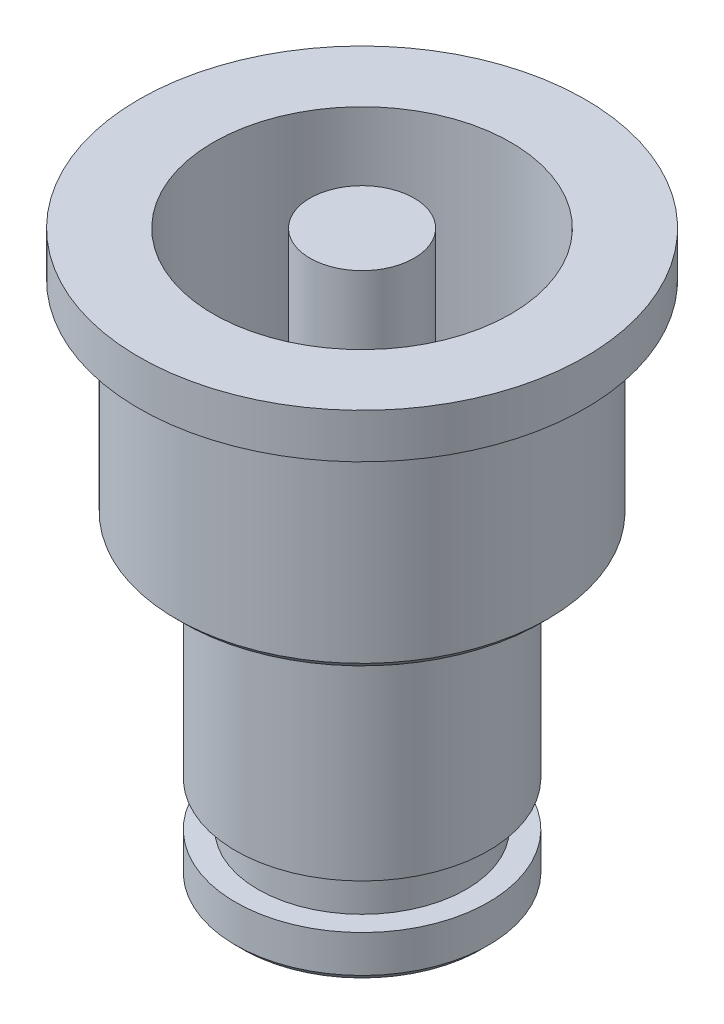
ISO-10303-21;
HEADER;
FILE_DESCRIPTION(('STEP AP214'),'2;1');
FILE_NAME('part.step','',(''),(''),'','','');
FILE_SCHEMA(('AUTOMOTIVE_DESIGN { 1 0 10303 214 1 1 1 1 }'));
ENDSEC;
DATA;
#1=APPLICATION_CONTEXT('core data for automotive mechanical design processes');
#2=APPLICATION_PROTOCOL_DEFINITION('international standard','automotive_design',2000,#1);
#3=PRODUCT_CONTEXT('',#1,'mechanical');
#4=PRODUCT('Part','Part','',(#3));
#5=PRODUCT_RELATED_PRODUCT_CATEGORY('part','',(#4));
#6=PRODUCT_DEFINITION_FORMATION('','',#4);
#7=PRODUCT_DEFINITION_CONTEXT('part definition',#1,'design');
#8=PRODUCT_DEFINITION('design','',#6,#7);
#9=PRODUCT_DEFINITION_SHAPE('','',#8);
#10=(LENGTH_UNIT() NAMED_UNIT(*) SI_UNIT(.MILLI.,.METRE.));
#11=(NAMED_UNIT(*) PLANE_ANGLE_UNIT() SI_UNIT($,.RADIAN.));
#12=(NAMED_UNIT(*) SI_UNIT($,.STERADIAN.) SOLID_ANGLE_UNIT());
#13=UNCERTAINTY_MEASURE_WITH_UNIT(LENGTH_MEASURE(1.E-05),#10,'distance_accuracy_value','');
#14=(GEOMETRIC_REPRESENTATION_CONTEXT(3) GLOBAL_UNCERTAINTY_ASSIGNED_CONTEXT((#13)) GLOBAL_UNIT_ASSIGNED_CONTEXT((#10,
#11,#12)) REPRESENTATION_CONTEXT('',''));
#15=CARTESIAN_POINT('',(0.,0.,0.));
#16=DIRECTION('',(0.,0.,1.));
#17=DIRECTION('',(1.,0.,0.));
#18=AXIS2_PLACEMENT_3D('',#15,#16,#17);
#19=CARTESIAN_POINT('',(0.,-5.,0.));
#20=DIRECTION('',(0.,-1.,0.));
#21=DIRECTION('',(1.,0.,0.));
#22=AXIS2_PLACEMENT_3D('',#19,#20,#21);
#23=PLANE('',#22);
#24=CARTESIAN_POINT('',(0.,-5.,0.));
#25=DIRECTION('',(0.,-1.,0.));
#26=DIRECTION('',(1.,0.,0.));
#27=AXIS2_PLACEMENT_3D('',#24,#25,#26);
#28=CIRCLE('',#27,10.);
#29=CARTESIAN_POINT('',(10.,-5.,0.));
#30=VERTEX_POINT('',#29);
#31=EDGE_CURVE('E159',#30,#30,#28,.F.);
#32=ORIENTED_EDGE('',*,*,#31,.F.);
#33=EDGE_LOOP('',(#32));
#34=FACE_BOUND('',#33,.T.);
#35=CARTESIAN_POINT('',(0.,-5.,0.));
#36=DIRECTION('',(0.,1.,0.));
#37=DIRECTION('',(-1.,0.,0.));
#38=AXIS2_PLACEMENT_3D('',#35,#36,#37);
#39=CIRCLE('',#38,15.);
#40=CARTESIAN_POINT('',(-15.,-5.,0.));
#41=VERTEX_POINT('',#40);
#42=EDGE_CURVE('E149',#41,#41,#39,.T.);
#43=ORIENTED_EDGE('',*,*,#42,.T.);
#44=EDGE_LOOP('',(#43));
#45=FACE_BOUND('',#44,.T.);
#46=ADVANCED_FACE('F46',(#34,#45),#23,.F.);
#47=CARTESIAN_POINT('',(0.,-5.,0.));
#48=DIRECTION('',(0.,1.,0.));
#49=DIRECTION('',(-1.,0.,0.));
#50=AXIS2_PLACEMENT_3D('',#47,#48,#49);
#51=CYLINDRICAL_SURFACE('',#50,15.);
#52=ORIENTED_EDGE('',*,*,#42,.F.);
#53=EDGE_LOOP('',(#52));
#54=FACE_BOUND('',#53,.T.);
#55=CARTESIAN_POINT('',(0.,-8.,0.));
#56=DIRECTION('',(0.,1.,0.));
#57=DIRECTION('',(-1.,0.,0.));
#58=AXIS2_PLACEMENT_3D('',#55,#56,#57);
#59=CIRCLE('',#58,15.);
#60=CARTESIAN_POINT('',(-15.,-8.,0.));
#61=VERTEX_POINT('',#60);
#62=EDGE_CURVE('E146',#61,#61,#59,.T.);
#63=ORIENTED_EDGE('',*,*,#62,.T.);
#64=EDGE_LOOP('',(#63));
#65=FACE_BOUND('',#64,.T.);
#66=ADVANCED_FACE('F190',(#54,#65),#51,.T.);
#67=CARTESIAN_POINT('',(15.,-8.,0.));
#68=DIRECTION('',(0.,1.,0.));
#69=DIRECTION('',(-1.,0.,0.));
#70=AXIS2_PLACEMENT_3D('',#67,#68,#69);
#71=PLANE('',#70);
#72=ORIENTED_EDGE('',*,*,#62,.F.);
#73=EDGE_LOOP('',(#72));
#74=FACE_BOUND('',#73,.T.);
#75=CARTESIAN_POINT('',(0.,-8.,0.));
#76=DIRECTION('',(0.,1.,0.));
#77=DIRECTION('',(-1.,0.,0.));
#78=AXIS2_PLACEMENT_3D('',#75,#76,#77);
#79=CIRCLE('',#78,12.5);
#80=CARTESIAN_POINT('',(-12.5,-8.,0.));
#81=VERTEX_POINT('',#80);
#82=EDGE_CURVE('E143',#81,#81,#79,.T.);
#83=ORIENTED_EDGE('',*,*,#82,.T.);
#84=EDGE_LOOP('',(#83));
#85=FACE_BOUND('',#84,.T.);
#86=ADVANCED_FACE('F197',(#74,#85),#71,.F.);
#87=CARTESIAN_POINT('',(0.,-5.,0.));
#88=DIRECTION('',(0.,1.,0.));
#89=DIRECTION('',(-1.,0.,0.));
#90=AXIS2_PLACEMENT_3D('',#87,#88,#89);
#91=CYLINDRICAL_SURFACE('',#90,12.5);
#92=CARTESIAN_POINT('',(0.,-21.5,0.));
#93=DIRECTION('',(0.,1.,0.));
#94=DIRECTION('',(-1.,0.,0.));
#95=AXIS2_PLACEMENT_3D('',#92,#93,#94);
#96=CIRCLE('',#95,12.5);
#97=CARTESIAN_POINT('',(-12.5,-21.5,0.));
#98=VERTEX_POINT('',#97);
#99=EDGE_CURVE('E56',#98,#98,#96,.T.);
#100=ORIENTED_EDGE('',*,*,#99,.T.);
#101=EDGE_LOOP('',(#100));
#102=FACE_BOUND('',#101,.T.);
#103=ORIENTED_EDGE('',*,*,#82,.F.);
#104=EDGE_LOOP('',(#103));
#105=FACE_BOUND('',#104,.T.);
#106=ADVANCED_FACE('F250',(#102,#105),#91,.T.);
#107=CARTESIAN_POINT('',(12.5,-22.,0.));
#108=DIRECTION('',(0.,1.,0.));
#109=DIRECTION('',(-1.,0.,0.));
#110=AXIS2_PLACEMENT_3D('',#107,#108,#109);
#111=PLANE('',#110);
#112=CARTESIAN_POINT('',(0.,-22.,0.));
#113=DIRECTION('',(0.,1.,0.));
#114=DIRECTION('',(-1.,0.,0.));
#115=AXIS2_PLACEMENT_3D('',#112,#113,#114);
#116=CIRCLE('',#115,12.);
#117=CARTESIAN_POINT('',(-12.,-22.,0.));
#118=VERTEX_POINT('',#117);
#119=EDGE_CURVE('E11',#118,#118,#116,.F.);
#120=ORIENTED_EDGE('',*,*,#119,.T.);
#121=EDGE_LOOP('',(#120));
#122=FACE_BOUND('',#121,.T.);
#123=CARTESIAN_POINT('',(0.,-22.,0.));
#124=DIRECTION('',(0.,1.,0.));
#125=DIRECTION('',(-1.,0.,0.));
#126=AXIS2_PLACEMENT_3D('',#123,#124,#125);
#127=CIRCLE('',#126,8.5);
#128=CARTESIAN_POINT('',(-8.5,-22.,0.));
#129=VERTEX_POINT('',#128);
#130=EDGE_CURVE('E140',#129,#129,#127,.T.);
#131=ORIENTED_EDGE('',*,*,#130,.T.);
#132=EDGE_LOOP('',(#131));
#133=FACE_BOUND('',#132,.T.);
#134=ADVANCED_FACE('F246',(#122,#133),#111,.F.);
#135=CARTESIAN_POINT('',(0.,-5.,0.));
#136=DIRECTION('',(0.,1.,0.));
#137=DIRECTION('',(-1.,0.,0.));
#138=AXIS2_PLACEMENT_3D('',#135,#136,#137);
#139=CYLINDRICAL_SURFACE('',#138,8.5);
#140=ORIENTED_EDGE('',*,*,#130,.F.);
#141=EDGE_LOOP('',(#140));
#142=FACE_BOUND('',#141,.T.);
#143=CARTESIAN_POINT('',(0.,-37.,0.));
#144=DIRECTION('',(0.,1.,0.));
#145=DIRECTION('',(-1.,0.,0.));
#146=AXIS2_PLACEMENT_3D('',#143,#144,#145);
#147=CIRCLE('',#146,8.5);
#148=CARTESIAN_POINT('',(-8.5,-37.,0.));
#149=VERTEX_POINT('',#148);
#150=EDGE_CURVE('E137',#149,#149,#147,.T.);
#151=ORIENTED_EDGE('',*,*,#150,.T.);
#152=EDGE_LOOP('',(#151));
#153=FACE_BOUND('',#152,.T.);
#154=ADVANCED_FACE('F242',(#142,#153),#139,.T.);
#155=CARTESIAN_POINT('',(8.5,-37.,0.));
#156=DIRECTION('',(0.,1.,0.));
#157=DIRECTION('',(-1.,0.,0.));
#158=AXIS2_PLACEMENT_3D('',#155,#156,#157);
#159=PLANE('',#158);
#160=ORIENTED_EDGE('',*,*,#150,.F.);
#161=EDGE_LOOP('',(#160));
#162=FACE_BOUND('',#161,.T.);
#163=CARTESIAN_POINT('',(0.,-37.,0.));
#164=DIRECTION('',(0.,1.,0.));
#165=DIRECTION('',(-1.,0.,0.));
#166=AXIS2_PLACEMENT_3D('',#163,#164,#165);
#167=CIRCLE('',#166,7.);
#168=CARTESIAN_POINT('',(-7.,-37.,0.));
#169=VERTEX_POINT('',#168);
#170=EDGE_CURVE('E134',#169,#169,#167,.T.);
#171=ORIENTED_EDGE('',*,*,#170,.T.);
#172=EDGE_LOOP('',(#171));
#173=FACE_BOUND('',#172,.T.);
#174=ADVANCED_FACE('F235',(#162,#173),#159,.F.);
#175=CARTESIAN_POINT('',(0.,-5.,0.));
#176=DIRECTION('',(0.,1.,0.));
#177=DIRECTION('',(-1.,0.,0.));
#178=AXIS2_PLACEMENT_3D('',#175,#176,#177);
#179=CYLINDRICAL_SURFACE('',#178,7.);
#180=ORIENTED_EDGE('',*,*,#170,.F.);
#181=EDGE_LOOP('',(#180));
#182=FACE_BOUND('',#181,.T.);
#183=CARTESIAN_POINT('',(0.,-40.,0.));
#184=DIRECTION('',(0.,1.,0.));
#185=DIRECTION('',(-1.,0.,0.));
#186=AXIS2_PLACEMENT_3D('',#183,#184,#185);
#187=CIRCLE('',#186,7.);
#188=CARTESIAN_POINT('',(-7.,-40.,0.));
#189=VERTEX_POINT('',#188);
#190=EDGE_CURVE('E131',#189,#189,#187,.T.);
#191=ORIENTED_EDGE('',*,*,#190,.T.);
#192=EDGE_LOOP('',(#191));
#193=FACE_BOUND('',#192,.T.);
#194=ADVANCED_FACE('F229',(#182,#193),#179,.T.);
#195=CARTESIAN_POINT('',(7.,-40.,0.));
#196=DIRECTION('',(0.,-1.,0.));
#197=DIRECTION('',(1.,0.,0.));
#198=AXIS2_PLACEMENT_3D('',#195,#196,#197);
#199=PLANE('',#198);
#200=ORIENTED_EDGE('',*,*,#190,.F.);
#201=EDGE_LOOP('',(#200));
#202=FACE_BOUND('',#201,.T.);
#203=CARTESIAN_POINT('',(0.,-40.,0.));
#204=DIRECTION('',(0.,1.,0.));
#205=DIRECTION('',(-1.,0.,0.));
#206=AXIS2_PLACEMENT_3D('',#203,#204,#205);
#207=CIRCLE('',#206,8.5);
#208=CARTESIAN_POINT('',(-8.5,-40.,0.));
#209=VERTEX_POINT('',#208);
#210=EDGE_CURVE('E126',#209,#209,#207,.T.);
#211=ORIENTED_EDGE('',*,*,#210,.T.);
#212=EDGE_LOOP('',(#211));
#213=FACE_BOUND('',#212,.T.);
#214=ADVANCED_FACE('F224',(#202,#213),#199,.F.);
#215=CARTESIAN_POINT('',(0.,-5.,0.));
#216=DIRECTION('',(0.,1.,0.));
#217=DIRECTION('',(-1.,0.,0.));
#218=AXIS2_PLACEMENT_3D('',#215,#216,#217);
#219=CYLINDRICAL_SURFACE('',#218,8.5);
#220=CARTESIAN_POINT('',(0.,-42.5,0.));
#221=DIRECTION('',(0.,1.,0.));
#222=DIRECTION('',(-1.,0.,0.));
#223=AXIS2_PLACEMENT_3D('',#220,#221,#222);
#224=CIRCLE('',#223,8.5);
#225=CARTESIAN_POINT('',(-8.5,-42.5,0.));
#226=VERTEX_POINT('',#225);
#227=EDGE_CURVE('E152',#226,#226,#224,.T.);
#228=ORIENTED_EDGE('',*,*,#227,.T.);
#229=EDGE_LOOP('',(#228));
#230=FACE_BOUND('',#229,.T.);
#231=ORIENTED_EDGE('',*,*,#210,.F.);
#232=EDGE_LOOP('',(#231));
#233=FACE_BOUND('',#232,.T.);
#234=ADVANCED_FACE('F215',(#230,#233),#219,.T.);
#235=CARTESIAN_POINT('',(8.50000000000001,-43.,0.));
#236=DIRECTION('',(0.,1.,0.));
#237=DIRECTION('',(-1.,0.,0.));
#238=AXIS2_PLACEMENT_3D('',#235,#236,#237);
#239=PLANE('',#238);
#240=DIRECTION('',(0.,0.,-1.));
#241=VECTOR('',#240,1.);
#242=CARTESIAN_POINT('',(-1.45,-43.,2.56904651573303));
#243=LINE('',#242,#241);
#244=CARTESIAN_POINT('',(-1.45,-43.,2.56904651573303));
#245=VERTEX_POINT('',#244);
#246=CARTESIAN_POINT('',(-1.44999999999999,-43.,-2.56904651573303));
#247=VERTEX_POINT('',#246);
#248=EDGE_CURVE('E99',#245,#247,#243,.T.);
#249=ORIENTED_EDGE('',*,*,#248,.F.);
#250=CARTESIAN_POINT('',(0.,-43.,0.));
#251=DIRECTION('',(0.,-1.,0.));
#252=DIRECTION('',(1.,0.,0.));
#253=AXIS2_PLACEMENT_3D('',#250,#251,#252);
#254=CIRCLE('',#253,2.95);
#255=CARTESIAN_POINT('',(1.45,-43.,2.56904651573303));
#256=VERTEX_POINT('',#255);
#257=EDGE_CURVE('E64',#256,#245,#254,.T.);
#258=ORIENTED_EDGE('',*,*,#257,.F.);
#259=DIRECTION('',(0.,0.,1.));
#260=VECTOR('',#259,1.);
#261=CARTESIAN_POINT('',(1.45,-43.,2.56904651573303));
#262=LINE('',#261,#260);
#263=CARTESIAN_POINT('',(1.45,-43.,-2.56904651573303));
#264=VERTEX_POINT('',#263);
#265=EDGE_CURVE('E115',#264,#256,#262,.T.);
#266=ORIENTED_EDGE('',*,*,#265,.F.);
#267=CARTESIAN_POINT('',(0.,-43.,0.));
#268=DIRECTION('',(0.,-1.,0.));
#269=DIRECTION('',(1.,0.,0.));
#270=AXIS2_PLACEMENT_3D('',#267,#268,#269);
#271=CIRCLE('',#270,2.95);
#272=EDGE_CURVE('E122',#247,#264,#271,.T.);
#273=ORIENTED_EDGE('',*,*,#272,.F.);
#274=EDGE_LOOP('',(#249,#258,#266,#273));
#275=FACE_BOUND('',#274,.T.);
#276=CARTESIAN_POINT('',(0.,-43.,0.));
#277=DIRECTION('',(0.,1.,0.));
#278=DIRECTION('',(-1.,0.,0.));
#279=AXIS2_PLACEMENT_3D('',#276,#277,#278);
#280=CIRCLE('',#279,7.99999999999999);
#281=CARTESIAN_POINT('',(-7.99999999999999,-43.,0.));
#282=VERTEX_POINT('',#281);
#283=EDGE_CURVE('E155',#282,#282,#280,.F.);
#284=ORIENTED_EDGE('',*,*,#283,.T.);
#285=EDGE_LOOP('',(#284));
#286=FACE_BOUND('',#285,.T.);
#287=ADVANCED_FACE('F207',(#275,#286),#239,.F.);
#288=CARTESIAN_POINT('',(0.,-42.5,0.));
#289=DIRECTION('',(0.,1.,0.));
#290=DIRECTION('',(-1.,0.,0.));
#291=AXIS2_PLACEMENT_3D('',#288,#289,#290);
#292=CONICAL_SURFACE('',#291,8.5,0.785398163397431);
#293=ORIENTED_EDGE('',*,*,#283,.F.);
#294=EDGE_LOOP('',(#293));
#295=FACE_BOUND('',#294,.T.);
#296=ORIENTED_EDGE('',*,*,#227,.F.);
#297=EDGE_LOOP('',(#296));
#298=FACE_BOUND('',#297,.T.);
#299=ADVANCED_FACE('F203',(#295,#298),#292,.T.);
#300=CARTESIAN_POINT('',(0.,-21.5,0.));
#301=DIRECTION('',(0.,1.,0.));
#302=DIRECTION('',(-1.,0.,0.));
#303=AXIS2_PLACEMENT_3D('',#300,#301,#302);
#304=CONICAL_SURFACE('',#303,12.5,0.785398163397454);
#305=ORIENTED_EDGE('',*,*,#119,.F.);
#306=EDGE_LOOP('',(#305));
#307=FACE_BOUND('',#306,.T.);
#308=ORIENTED_EDGE('',*,*,#99,.F.);
#309=EDGE_LOOP('',(#308));
#310=FACE_BOUND('',#309,.T.);
#311=ADVANCED_FACE('F49',(#307,#310),#304,.T.);
#312=CARTESIAN_POINT('',(0.,-35.,0.));
#313=DIRECTION('',(0.,-1.,0.));
#314=DIRECTION('',(1.,0.,0.));
#315=AXIS2_PLACEMENT_3D('',#312,#313,#314);
#316=CYLINDRICAL_SURFACE('',#315,2.95);
#317=ORIENTED_EDGE('',*,*,#257,.T.);
#318=DIRECTION('',(0.,-1.,0.));
#319=VECTOR('',#318,1.);
#320=CARTESIAN_POINT('',(-1.45,-35.,2.56904651573303));
#321=LINE('',#320,#319);
#322=CARTESIAN_POINT('',(-1.45,-35.,2.56904651573303));
#323=VERTEX_POINT('',#322);
#324=EDGE_CURVE('E87',#323,#245,#321,.T.);
#325=ORIENTED_EDGE('',*,*,#324,.F.);
#326=CARTESIAN_POINT('',(0.,-35.,0.));
#327=DIRECTION('',(0.,-1.,0.));
#328=DIRECTION('',(1.,0.,0.));
#329=AXIS2_PLACEMENT_3D('',#326,#327,#328);
#330=CIRCLE('',#329,2.95);
#331=CARTESIAN_POINT('',(1.45,-35.,2.56904651573303));
#332=VERTEX_POINT('',#331);
#333=EDGE_CURVE('E113',#332,#323,#330,.T.);
#334=ORIENTED_EDGE('',*,*,#333,.F.);
#335=DIRECTION('',(0.,-1.,0.));
#336=VECTOR('',#335,1.);
#337=CARTESIAN_POINT('',(1.45,-35.,2.56904651573303));
#338=LINE('',#337,#336);
#339=EDGE_CURVE('E72',#332,#256,#338,.T.);
#340=ORIENTED_EDGE('',*,*,#339,.T.);
#341=EDGE_LOOP('',(#317,#325,#334,#340));
#342=FACE_BOUND('',#341,.T.);
#343=ADVANCED_FACE('F213',(#342),#316,.F.);
#344=CARTESIAN_POINT('',(1.45,-35.,2.56904651573303));
#345=DIRECTION('',(1.,0.,0.));
#346=DIRECTION('',(0.,0.,-1.));
#347=AXIS2_PLACEMENT_3D('',#344,#345,#346);
#348=PLANE('',#347);
#349=ORIENTED_EDGE('',*,*,#265,.T.);
#350=ORIENTED_EDGE('',*,*,#339,.F.);
#351=DIRECTION('',(0.,0.,1.));
#352=VECTOR('',#351,1.);
#353=CARTESIAN_POINT('',(1.45,-35.,2.56904651573303));
#354=LINE('',#353,#352);
#355=CARTESIAN_POINT('',(1.45,-35.,-2.56904651573303));
#356=VERTEX_POINT('',#355);
#357=EDGE_CURVE('E110',#356,#332,#354,.T.);
#358=ORIENTED_EDGE('',*,*,#357,.F.);
#359=DIRECTION('',(0.,-1.,0.));
#360=VECTOR('',#359,1.);
#361=CARTESIAN_POINT('',(1.45,-35.,-2.56904651573303));
#362=LINE('',#361,#360);
#363=EDGE_CURVE('E103',#356,#264,#362,.T.);
#364=ORIENTED_EDGE('',*,*,#363,.T.);
#365=EDGE_LOOP('',(#349,#350,#358,#364));
#366=FACE_BOUND('',#365,.T.);
#367=ADVANCED_FACE('F321',(#366),#348,.F.);
#368=CARTESIAN_POINT('',(0.,-35.,0.));
#369=DIRECTION('',(0.,-1.,0.));
#370=DIRECTION('',(1.,0.,0.));
#371=AXIS2_PLACEMENT_3D('',#368,#369,#370);
#372=CYLINDRICAL_SURFACE('',#371,2.95);
#373=ORIENTED_EDGE('',*,*,#272,.T.);
#374=ORIENTED_EDGE('',*,*,#363,.F.);
#375=CARTESIAN_POINT('',(0.,-35.,0.));
#376=DIRECTION('',(0.,-1.,0.));
#377=DIRECTION('',(1.,0.,0.));
#378=AXIS2_PLACEMENT_3D('',#375,#376,#377);
#379=CIRCLE('',#378,2.95);
#380=CARTESIAN_POINT('',(-1.45,-35.,-2.56904651573303));
#381=VERTEX_POINT('',#380);
#382=EDGE_CURVE('E106',#381,#356,#379,.T.);
#383=ORIENTED_EDGE('',*,*,#382,.F.);
#384=DIRECTION('',(0.,-1.,0.));
#385=VECTOR('',#384,1.);
#386=CARTESIAN_POINT('',(-1.45,-35.,-2.56904651573303));
#387=LINE('',#386,#385);
#388=EDGE_CURVE('E92',#381,#247,#387,.T.);
#389=ORIENTED_EDGE('',*,*,#388,.T.);
#390=EDGE_LOOP('',(#373,#374,#383,#389));
#391=FACE_BOUND('',#390,.T.);
#392=ADVANCED_FACE('F107',(#391),#372,.F.);
#393=CARTESIAN_POINT('',(-1.45,-35.,2.56904651573303));
#394=DIRECTION('',(-1.,0.,0.));
#395=DIRECTION('',(0.,0.,1.));
#396=AXIS2_PLACEMENT_3D('',#393,#394,#395);
#397=PLANE('',#396);
#398=ORIENTED_EDGE('',*,*,#248,.T.);
#399=ORIENTED_EDGE('',*,*,#388,.F.);
#400=DIRECTION('',(0.,0.,-1.));
#401=VECTOR('',#400,1.);
#402=CARTESIAN_POINT('',(-1.45,-35.,2.56904651573303));
#403=LINE('',#402,#401);
#404=EDGE_CURVE('E96',#323,#381,#403,.T.);
#405=ORIENTED_EDGE('',*,*,#404,.F.);
#406=ORIENTED_EDGE('',*,*,#324,.T.);
#407=EDGE_LOOP('',(#398,#399,#405,#406));
#408=FACE_BOUND('',#407,.T.);
#409=ADVANCED_FACE('F94',(#408),#397,.F.);
#410=CARTESIAN_POINT('',(0.,-35.,0.));
#411=DIRECTION('',(0.,-1.,0.));
#412=DIRECTION('',(1.,0.,0.));
#413=AXIS2_PLACEMENT_3D('',#410,#411,#412);
#414=PLANE('',#413);
#415=ORIENTED_EDGE('',*,*,#333,.T.);
#416=ORIENTED_EDGE('',*,*,#404,.T.);
#417=ORIENTED_EDGE('',*,*,#382,.T.);
#418=ORIENTED_EDGE('',*,*,#357,.T.);
#419=EDGE_LOOP('',(#415,#416,#417,#418));
#420=FACE_BOUND('',#419,.T.);
#421=ADVANCED_FACE('F112',(#420),#414,.T.);
#422=CARTESIAN_POINT('',(0.,-4.999988,0.));
#423=DIRECTION('',(0.,-1.,0.));
#424=DIRECTION('',(1.,0.,0.));
#425=AXIS2_PLACEMENT_3D('',#422,#423,#424);
#426=CYLINDRICAL_SURFACE('',#425,3.5);
#427=CARTESIAN_POINT('',(0.,-20.,0.));
#428=DIRECTION('',(0.,1.,0.));
#429=DIRECTION('',(-1.,0.,0.));
#430=AXIS2_PLACEMENT_3D('',#427,#428,#429);
#431=CIRCLE('',#430,3.5);
#432=CARTESIAN_POINT('',(3.5,-20.,0.));
#433=VERTEX_POINT('',#432);
#434=EDGE_CURVE('E166',#433,#433,#431,.T.);
#435=CARTESIAN_POINT('',(0.,-5.,0.));
#436=DIRECTION('',(0.,-1.,0.));
#437=DIRECTION('',(1.,0.,0.));
#438=AXIS2_PLACEMENT_3D('',#435,#436,#437);
#439=CIRCLE('',#438,3.5);
#440=CARTESIAN_POINT('',(3.5,-5.,0.));
#441=VERTEX_POINT('',#440);
#442=EDGE_CURVE('E51',#441,#441,#439,.F.);
#443=CARTESIAN_POINT('',(3.5,-20.,0.));
#444=CARTESIAN_POINT('',(3.5,-19.84375,0.));
#445=CARTESIAN_POINT('',(3.5,-19.6875,0.));
#446=CARTESIAN_POINT('',(3.5,-19.375,0.));
#447=CARTESIAN_POINT('',(3.5,-19.21875,0.));
#448=CARTESIAN_POINT('',(3.5,-18.90625,0.));
#449=CARTESIAN_POINT('',(3.5,-18.75,0.));
#450=CARTESIAN_POINT('',(3.5,-18.4375,0.));
#451=CARTESIAN_POINT('',(3.5,-18.28125,0.));
#452=CARTESIAN_POINT('',(3.5,-17.96875,0.));
#453=CARTESIAN_POINT('',(3.5,-17.8125,0.));
#454=CARTESIAN_POINT('',(3.5,-17.5,0.));
#455=CARTESIAN_POINT('',(3.5,-17.34375,0.));
#456=CARTESIAN_POINT('',(3.5,-17.03125,0.));
#457=CARTESIAN_POINT('',(3.5,-16.875,0.));
#458=CARTESIAN_POINT('',(3.5,-16.5625,0.));
#459=CARTESIAN_POINT('',(3.5,-16.40625,0.));
#460=CARTESIAN_POINT('',(3.5,-16.09375,0.));
#461=CARTESIAN_POINT('',(3.5,-15.9375,0.));
#462=CARTESIAN_POINT('',(3.5,-15.625,0.));
#463=CARTESIAN_POINT('',(3.5,-15.46875,0.));
#464=CARTESIAN_POINT('',(3.5,-15.15625,0.));
#465=CARTESIAN_POINT('',(3.5,-15.,0.));
#466=CARTESIAN_POINT('',(3.5,-14.6875,0.));
#467=CARTESIAN_POINT('',(3.5,-14.53125,0.));
#468=CARTESIAN_POINT('',(3.5,-14.21875,0.));
#469=CARTESIAN_POINT('',(3.5,-14.0625,0.));
#470=CARTESIAN_POINT('',(3.5,-13.75,0.));
#471=CARTESIAN_POINT('',(3.5,-13.59375,0.));
#472=CARTESIAN_POINT('',(3.5,-13.28125,0.));
#473=CARTESIAN_POINT('',(3.5,-13.125,0.));
#474=CARTESIAN_POINT('',(3.5,-12.8125,0.));
#475=CARTESIAN_POINT('',(3.5,-12.65625,0.));
#476=CARTESIAN_POINT('',(3.5,-12.34375,0.));
#477=CARTESIAN_POINT('',(3.5,-12.1875,0.));
#478=CARTESIAN_POINT('',(3.5,-11.875,0.));
#479=CARTESIAN_POINT('',(3.5,-11.71875,0.));
#480=CARTESIAN_POINT('',(3.5,-11.40625,0.));
#481=CARTESIAN_POINT('',(3.5,-11.25,0.));
#482=CARTESIAN_POINT('',(3.5,-10.9375,0.));
#483=CARTESIAN_POINT('',(3.5,-10.78125,0.));
#484=CARTESIAN_POINT('',(3.5,-10.46875,0.));
#485=CARTESIAN_POINT('',(3.5,-10.3125,0.));
#486=CARTESIAN_POINT('',(3.5,-10.,0.));
#487=CARTESIAN_POINT('',(3.5,-9.84375,0.));
#488=CARTESIAN_POINT('',(3.5,-9.53125,0.));
#489=CARTESIAN_POINT('',(3.5,-9.375,0.));
#490=CARTESIAN_POINT('',(3.5,-9.0625,0.));
#491=CARTESIAN_POINT('',(3.5,-8.90625,0.));
#492=CARTESIAN_POINT('',(3.5,-8.59375,0.));
#493=CARTESIAN_POINT('',(3.5,-8.4375,0.));
#494=CARTESIAN_POINT('',(3.5,-8.125,0.));
#495=CARTESIAN_POINT('',(3.5,-7.96875,0.));
#496=CARTESIAN_POINT('',(3.5,-7.65625,0.));
#497=CARTESIAN_POINT('',(3.5,-7.5,0.));
#498=CARTESIAN_POINT('',(3.5,-7.1875,0.));
#499=CARTESIAN_POINT('',(3.5,-7.03125,0.));
#500=CARTESIAN_POINT('',(3.5,-6.71875,0.));
#501=CARTESIAN_POINT('',(3.5,-6.5625,0.));
#502=CARTESIAN_POINT('',(3.5,-6.25,0.));
#503=CARTESIAN_POINT('',(3.5,-6.09375,0.));
#504=CARTESIAN_POINT('',(3.5,-5.78125,0.));
#505=CARTESIAN_POINT('',(3.5,-5.625,0.));
#506=CARTESIAN_POINT('',(3.5,-5.3125,0.));
#507=CARTESIAN_POINT('',(3.5,-5.15625,0.));
#508=CARTESIAN_POINT('',(3.5,-5.,0.));
#509=B_SPLINE_CURVE_WITH_KNOTS('',3,(#443,#444,#445,#446,#447,#448,#449,#450,#451,#452,#453,
#454,#455,#456,#457,#458,#459,#460,#461,#462,#463,#464,#465,#466,#467,#468,#469,#470,#471,#472,
#473,#474,#475,#476,#477,#478,#479,#480,#481,#482,#483,#484,#485,#486,#487,#488,#489,#490,#491,
#492,#493,#494,#495,#496,#497,#498,#499,#500,#501,#502,#503,#504,#505,#506,#507,#508),
.UNSPECIFIED.,.F.,.F.,(4,2,2,2,2,2,2,2,2,2,2,2,2,2,2,2,2,2,2,2,2,2,2,2,2,2,2,2,2,2,2,2,4),(0.,
0.46875,0.937499999999997,1.40625,1.875,2.34375,2.8125,3.28125,3.75,4.21875,4.6875,5.15625,
5.625,6.09375,6.5625,7.03125,7.5,7.96875,8.4375,8.90625,9.375,9.84375,10.3125,10.78125,11.25,
11.71875,12.1875,12.65625,13.125,13.59375,14.0625,14.53125,15.),.UNSPECIFIED.);
#510=EDGE_CURVE('BSEAM173',#433,#441,#509,.T.);
#511=ORIENTED_EDGE('',*,*,#434,.T.);
#512=ORIENTED_EDGE('',*,*,#442,.F.);
#513=ORIENTED_EDGE('',*,*,#510,.T.);
#514=ORIENTED_EDGE('',*,*,#510,.F.);
#515=EDGE_LOOP('',(#511,#513,#512,#514));
#516=FACE_BOUND('',#515,.T.);
#517=ADVANCED_FACE('F173',(#516),#426,.T.);
#518=CARTESIAN_POINT('',(0.,-4.999988,0.));
#519=DIRECTION('',(0.,-1.,0.));
#520=DIRECTION('',(1.,0.,0.));
#521=AXIS2_PLACEMENT_3D('',#518,#519,#520);
#522=CYLINDRICAL_SURFACE('',#521,10.);
#523=CARTESIAN_POINT('',(0.,-20.,0.));
#524=DIRECTION('',(0.,1.,0.));
#525=DIRECTION('',(-1.,0.,0.));
#526=AXIS2_PLACEMENT_3D('',#523,#524,#525);
#527=CIRCLE('',#526,10.);
#528=CARTESIAN_POINT('',(10.,-20.,0.));
#529=VERTEX_POINT('',#528);
#530=EDGE_CURVE('E161',#529,#529,#527,.T.);
#531=CARTESIAN_POINT('',(10.,-20.,0.));
#532=CARTESIAN_POINT('',(10.,-19.84375,0.));
#533=CARTESIAN_POINT('',(10.,-19.6875,0.));
#534=CARTESIAN_POINT('',(10.,-19.375,0.));
#535=CARTESIAN_POINT('',(10.,-19.21875,0.));
#536=CARTESIAN_POINT('',(10.,-18.90625,0.));
#537=CARTESIAN_POINT('',(10.,-18.75,0.));
#538=CARTESIAN_POINT('',(10.,-18.4375,0.));
#539=CARTESIAN_POINT('',(10.,-18.28125,0.));
#540=CARTESIAN_POINT('',(10.,-17.96875,0.));
#541=CARTESIAN_POINT('',(10.,-17.8125,0.));
#542=CARTESIAN_POINT('',(10.,-17.5,0.));
#543=CARTESIAN_POINT('',(10.,-17.34375,0.));
#544=CARTESIAN_POINT('',(10.,-17.03125,0.));
#545=CARTESIAN_POINT('',(10.,-16.875,0.));
#546=CARTESIAN_POINT('',(10.,-16.5625,0.));
#547=CARTESIAN_POINT('',(10.,-16.40625,0.));
#548=CARTESIAN_POINT('',(10.,-16.09375,0.));
#549=CARTESIAN_POINT('',(10.,-15.9375,0.));
#550=CARTESIAN_POINT('',(10.,-15.625,0.));
#551=CARTESIAN_POINT('',(10.,-15.46875,0.));
#552=CARTESIAN_POINT('',(10.,-15.15625,0.));
#553=CARTESIAN_POINT('',(10.,-15.,0.));
#554=CARTESIAN_POINT('',(10.,-14.6875,0.));
#555=CARTESIAN_POINT('',(10.,-14.53125,0.));
#556=CARTESIAN_POINT('',(10.,-14.21875,0.));
#557=CARTESIAN_POINT('',(10.,-14.0625,0.));
#558=CARTESIAN_POINT('',(10.,-13.75,0.));
#559=CARTESIAN_POINT('',(10.,-13.59375,0.));
#560=CARTESIAN_POINT('',(10.,-13.28125,0.));
#561=CARTESIAN_POINT('',(10.,-13.125,0.));
#562=CARTESIAN_POINT('',(10.,-12.8125,0.));
#563=CARTESIAN_POINT('',(10.,-12.65625,0.));
#564=CARTESIAN_POINT('',(10.,-12.34375,0.));
#565=CARTESIAN_POINT('',(10.,-12.1875,0.));
#566=CARTESIAN_POINT('',(10.,-11.875,0.));
#567=CARTESIAN_POINT('',(10.,-11.71875,0.));
#568=CARTESIAN_POINT('',(10.,-11.40625,0.));
#569=CARTESIAN_POINT('',(10.,-11.25,0.));
#570=CARTESIAN_POINT('',(10.,-10.9375,0.));
#571=CARTESIAN_POINT('',(10.,-10.78125,0.));
#572=CARTESIAN_POINT('',(10.,-10.46875,0.));
#573=CARTESIAN_POINT('',(10.,-10.3125,0.));
#574=CARTESIAN_POINT('',(10.,-9.99999999999999,0.));
#575=CARTESIAN_POINT('',(10.,-9.84374999999999,0.));
#576=CARTESIAN_POINT('',(10.,-9.53124999999999,0.));
#577=CARTESIAN_POINT('',(10.,-9.37499999999999,0.));
#578=CARTESIAN_POINT('',(10.,-9.0625,0.));
#579=CARTESIAN_POINT('',(10.,-8.90625,0.));
#580=CARTESIAN_POINT('',(10.,-8.59375,0.));
#581=CARTESIAN_POINT('',(10.,-8.4375,0.));
#582=CARTESIAN_POINT('',(10.,-8.125,0.));
#583=CARTESIAN_POINT('',(10.,-7.96875,0.));
#584=CARTESIAN_POINT('',(10.,-7.65625,0.));
#585=CARTESIAN_POINT('',(10.,-7.5,0.));
#586=CARTESIAN_POINT('',(10.,-7.1875,0.));
#587=CARTESIAN_POINT('',(10.,-7.03125,0.));
#588=CARTESIAN_POINT('',(10.,-6.71875,0.));
#589=CARTESIAN_POINT('',(10.,-6.5625,0.));
#590=CARTESIAN_POINT('',(10.,-6.25,0.));
#591=CARTESIAN_POINT('',(10.,-6.09375,0.));
#592=CARTESIAN_POINT('',(10.,-5.78125,0.));
#593=CARTESIAN_POINT('',(10.,-5.625,0.));
#594=CARTESIAN_POINT('',(10.,-5.3125,0.));
#595=CARTESIAN_POINT('',(10.,-5.15625,0.));
#596=CARTESIAN_POINT('',(10.,-5.,0.));
#597=B_SPLINE_CURVE_WITH_KNOTS('',3,(#531,#532,#533,#534,#535,#536,#537,#538,#539,#540,#541,
#542,#543,#544,#545,#546,#547,#548,#549,#550,#551,#552,#553,#554,#555,#556,#557,#558,#559,#560,
#561,#562,#563,#564,#565,#566,#567,#568,#569,#570,#571,#572,#573,#574,#575,#576,#577,#578,#579,
#580,#581,#582,#583,#584,#585,#586,#587,#588,#589,#590,#591,#592,#593,#594,#595,#596),
.UNSPECIFIED.,.F.,.F.,(4,2,2,2,2,2,2,2,2,2,2,2,2,2,2,2,2,2,2,2,2,2,2,2,2,2,2,2,2,2,2,2,4),(0.,
0.46875,0.937499999999997,1.40625,1.875,2.34375,2.8125,3.28125,3.75,4.21875,4.6875,5.15625,
5.625,6.09375,6.5625,7.03125,7.5,7.96875,8.4375,8.90625,9.375,9.84375,10.3125,10.78125,11.25,
11.71875,12.1875,12.65625,13.125,13.59375,14.0625,14.53125,15.),.UNSPECIFIED.);
#598=EDGE_CURVE('BSEAM179',#529,#30,#597,.T.);
#599=ORIENTED_EDGE('',*,*,#530,.F.);
#600=ORIENTED_EDGE('',*,*,#31,.T.);
#601=ORIENTED_EDGE('',*,*,#598,.T.);
#602=ORIENTED_EDGE('',*,*,#598,.F.);
#603=EDGE_LOOP('',(#599,#601,#600,#602));
#604=FACE_BOUND('',#603,.T.);
#605=ADVANCED_FACE('F179',(#604),#522,.F.);
#606=CARTESIAN_POINT('',(0.,-20.,0.));
#607=DIRECTION('',(0.,1.,0.));
#608=DIRECTION('',(-1.,0.,0.));
#609=AXIS2_PLACEMENT_3D('',#606,#607,#608);
#610=PLANE('',#609);
#611=ORIENTED_EDGE('',*,*,#434,.F.);
#612=EDGE_LOOP('',(#611));
#613=FACE_BOUND('',#612,.T.);
#614=ORIENTED_EDGE('',*,*,#530,.T.);
#615=EDGE_LOOP('',(#614));
#616=FACE_BOUND('',#615,.T.);
#617=ADVANCED_FACE('F176',(#613,#616),#610,.T.);
#618=ORIENTED_EDGE('',*,*,#442,.T.);
#619=EDGE_LOOP('',(#618));
#620=FACE_BOUND('',#619,.T.);
#621=ADVANCED_FACE('F178',(#620),#23,.F.);
#622=CLOSED_SHELL('',(#46,#66,#86,#106,#134,#154,#174,#194,#214,#234,#287,#299,#311,#343,#367,
#392,#409,#421,#517,#605,#617,#621));
#623=MANIFOLD_SOLID_BREP('B2',#622);
#624=ADVANCED_BREP_SHAPE_REPRESENTATION('',(#18,#623),#14);
#625=SHAPE_DEFINITION_REPRESENTATION(#9,#624);
ENDSEC;
END-ISO-10303-21;
